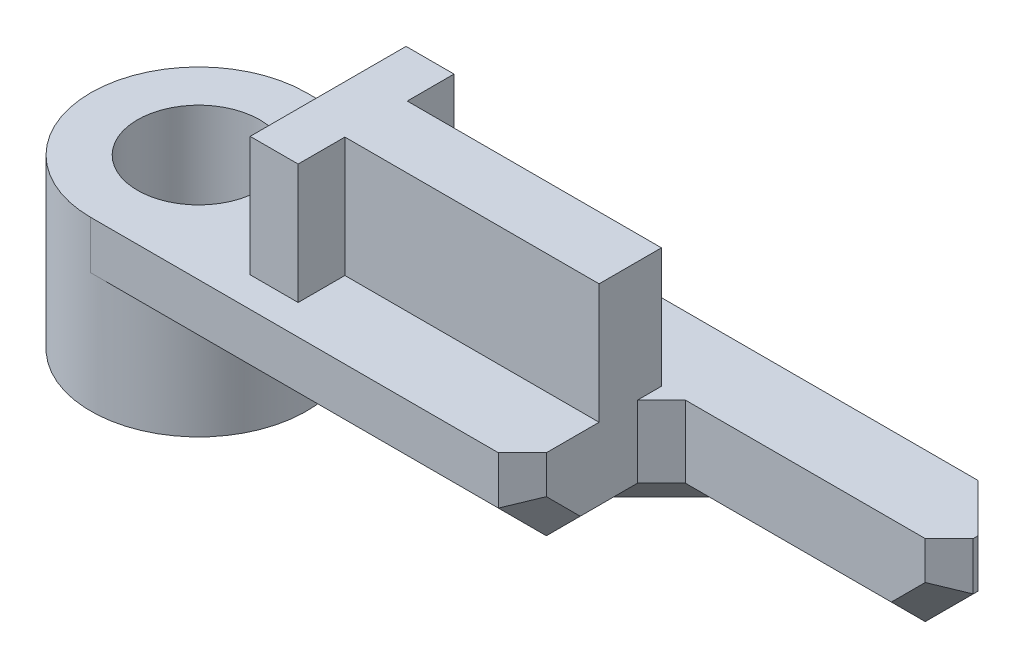
ISO-10303-21;
HEADER;
FILE_DESCRIPTION(('STEP AP214'),'2;1');
FILE_NAME('part.step','',(''),(''),'','','');
FILE_SCHEMA(('AUTOMOTIVE_DESIGN { 1 0 10303 214 1 1 1 1 }'));
ENDSEC;
DATA;
#1=APPLICATION_CONTEXT('core data for automotive mechanical design processes');
#2=APPLICATION_PROTOCOL_DEFINITION('international standard','automotive_design',2000,#1);
#3=PRODUCT_CONTEXT('',#1,'mechanical');
#4=PRODUCT('Part','Part','',(#3));
#5=PRODUCT_RELATED_PRODUCT_CATEGORY('part','',(#4));
#6=PRODUCT_DEFINITION_FORMATION('','',#4);
#7=PRODUCT_DEFINITION_CONTEXT('part definition',#1,'design');
#8=PRODUCT_DEFINITION('design','',#6,#7);
#9=PRODUCT_DEFINITION_SHAPE('','',#8);
#10=(LENGTH_UNIT() NAMED_UNIT(*) SI_UNIT(.MILLI.,.METRE.));
#11=(NAMED_UNIT(*) PLANE_ANGLE_UNIT() SI_UNIT($,.RADIAN.));
#12=(NAMED_UNIT(*) SI_UNIT($,.STERADIAN.) SOLID_ANGLE_UNIT());
#13=UNCERTAINTY_MEASURE_WITH_UNIT(LENGTH_MEASURE(1.E-05),#10,'distance_accuracy_value','');
#14=(GEOMETRIC_REPRESENTATION_CONTEXT(3) GLOBAL_UNCERTAINTY_ASSIGNED_CONTEXT((#13)) GLOBAL_UNIT_ASSIGNED_CONTEXT((#10,
#11,#12)) REPRESENTATION_CONTEXT('',''));
#15=CARTESIAN_POINT('',(0.,0.,0.));
#16=DIRECTION('',(0.,0.,1.));
#17=DIRECTION('',(1.,0.,0.));
#18=AXIS2_PLACEMENT_3D('',#15,#16,#17);
#19=CARTESIAN_POINT('',(0.,3.,0.));
#20=DIRECTION('',(0.,1.,0.));
#21=DIRECTION('',(0.,0.,-1.));
#22=AXIS2_PLACEMENT_3D('',#19,#20,#21);
#23=PLANE('',#22);
#24=DIRECTION('',(1.,0.,0.));
#25=VECTOR('',#24,1.);
#26=CARTESIAN_POINT('',(0.,3.,2.5));
#27=LINE('',#26,#25);
#28=CARTESIAN_POINT('',(3.74165738677394,3.,2.5));
#29=VERTEX_POINT('',#28);
#30=CARTESIAN_POINT('',(17.,3.,2.5));
#31=VERTEX_POINT('',#30);
#32=EDGE_CURVE('E310',#29,#31,#27,.T.);
#33=ORIENTED_EDGE('',*,*,#32,.F.);
#34=CARTESIAN_POINT('',(0.,3.,0.));
#35=DIRECTION('',(0.,-1.,0.));
#36=DIRECTION('',(0.,0.,-1.));
#37=AXIS2_PLACEMENT_3D('',#34,#35,#36);
#38=CIRCLE('',#37,4.5);
#39=CARTESIAN_POINT('',(3.74165738677394,3.,-2.5));
#40=VERTEX_POINT('',#39);
#41=EDGE_CURVE('E300',#40,#29,#38,.T.);
#42=ORIENTED_EDGE('',*,*,#41,.F.);
#43=DIRECTION('',(-1.,0.,0.));
#44=VECTOR('',#43,1.);
#45=CARTESIAN_POINT('',(0.,3.,-2.5));
#46=LINE('',#45,#44);
#47=CARTESIAN_POINT('',(28.,3.,-2.5));
#48=VERTEX_POINT('',#47);
#49=EDGE_CURVE('E316',#48,#40,#46,.T.);
#50=ORIENTED_EDGE('',*,*,#49,.F.);
#51=DIRECTION('',(0.,0.,-1.));
#52=VECTOR('',#51,1.);
#53=CARTESIAN_POINT('',(28.,3.,0.));
#54=LINE('',#53,#52);
#55=CARTESIAN_POINT('',(28.,3.,-2.29999999999999));
#56=VERTEX_POINT('',#55);
#57=EDGE_CURVE('E313',#56,#48,#54,.T.);
#58=ORIENTED_EDGE('',*,*,#57,.F.);
#59=DIRECTION('',(1.,0.,0.));
#60=VECTOR('',#59,1.);
#61=CARTESIAN_POINT('',(28.,3.,-2.29999999999999));
#62=LINE('',#61,#60);
#63=CARTESIAN_POINT('',(19.,3.,-2.29999999999999));
#64=VERTEX_POINT('',#63);
#65=EDGE_CURVE('E368',#64,#56,#62,.T.);
#66=ORIENTED_EDGE('',*,*,#65,.F.);
#67=DIRECTION('',(-0.707106781186552,0.,0.707106781186543));
#68=VECTOR('',#67,1.);
#69=CARTESIAN_POINT('',(17.,3.,-0.300000000000007));
#70=LINE('',#69,#68);
#71=CARTESIAN_POINT('',(18.,3.,-1.3));
#72=VERTEX_POINT('',#71);
#73=EDGE_CURVE('E371',#64,#72,#70,.T.);
#74=ORIENTED_EDGE('',*,*,#73,.T.);
#75=DIRECTION('',(-0.707106781186552,0.,0.707106781186543));
#76=VECTOR('',#75,1.);
#77=CARTESIAN_POINT('',(17.,3.,-0.300000000000007));
#78=LINE('',#77,#76);
#79=CARTESIAN_POINT('',(17.,3.,-0.300000000000006));
#80=VERTEX_POINT('',#79);
#81=EDGE_CURVE('E374',#72,#80,#78,.T.);
#82=ORIENTED_EDGE('',*,*,#81,.T.);
#83=DIRECTION('',(0.,0.,-1.));
#84=VECTOR('',#83,1.);
#85=CARTESIAN_POINT('',(17.,3.,-1.3));
#86=LINE('',#85,#84);
#87=EDGE_CURVE('E377',#31,#80,#86,.T.);
#88=ORIENTED_EDGE('',*,*,#87,.F.);
#89=EDGE_LOOP('',(#33,#42,#50,#58,#66,#74,#82,#88));
#90=FACE_BOUND('',#89,.T.);
#91=ADVANCED_FACE('F41',(#90),#23,.F.);
#92=CARTESIAN_POINT('',(0.,6.99999999999999,0.));
#93=DIRECTION('',(0.,1.,0.));
#94=DIRECTION('',(0.,0.,-1.));
#95=AXIS2_PLACEMENT_3D('',#92,#93,#94);
#96=PLANE('',#95);
#97=CARTESIAN_POINT('',(0.,6.99999999999999,0.));
#98=DIRECTION('',(0.,-1.,0.));
#99=DIRECTION('',(0.,0.,-1.));
#100=AXIS2_PLACEMENT_3D('',#97,#98,#99);
#101=CIRCLE('',#100,2.55);
#102=CARTESIAN_POINT('',(0.,6.99999999999999,-2.55));
#103=VERTEX_POINT('',#102);
#104=EDGE_CURVE('E274',#103,#103,#101,.T.);
#105=ORIENTED_EDGE('',*,*,#104,.T.);
#106=EDGE_LOOP('',(#105));
#107=FACE_BOUND('',#106,.T.);
#108=DIRECTION('',(0.,0.,1.));
#109=VECTOR('',#108,1.);
#110=CARTESIAN_POINT('',(18.,6.99999999999999,0.));
#111=LINE('',#110,#109);
#112=CARTESIAN_POINT('',(18.,6.99999999999999,1.3));
#113=VERTEX_POINT('',#112);
#114=CARTESIAN_POINT('',(18.,6.99999999999999,3.5));
#115=VERTEX_POINT('',#114);
#116=EDGE_CURVE('E270',#113,#115,#111,.T.);
#117=ORIENTED_EDGE('',*,*,#116,.F.);
#118=DIRECTION('',(1.,0.,0.));
#119=VECTOR('',#118,1.);
#120=CARTESIAN_POINT('',(0.,6.99999999999999,1.3));
#121=LINE('',#120,#119);
#122=CARTESIAN_POINT('',(7.4,6.99999999999999,1.3));
#123=VERTEX_POINT('',#122);
#124=EDGE_CURVE('E243',#123,#113,#121,.T.);
#125=ORIENTED_EDGE('',*,*,#124,.F.);
#126=DIRECTION('',(0.,0.,1.));
#127=VECTOR('',#126,1.);
#128=CARTESIAN_POINT('',(7.4,6.99999999999999,0.));
#129=LINE('',#128,#127);
#130=CARTESIAN_POINT('',(7.4,6.99999999999999,3.25));
#131=VERTEX_POINT('',#130);
#132=EDGE_CURVE('E214',#123,#131,#129,.T.);
#133=ORIENTED_EDGE('',*,*,#132,.T.);
#134=DIRECTION('',(1.,0.,0.));
#135=VECTOR('',#134,1.);
#136=CARTESIAN_POINT('',(0.,6.99999999999999,3.25));
#137=LINE('',#136,#135);
#138=CARTESIAN_POINT('',(5.4,6.99999999999999,3.25));
#139=VERTEX_POINT('',#138);
#140=EDGE_CURVE('E246',#139,#131,#137,.T.);
#141=ORIENTED_EDGE('',*,*,#140,.F.);
#142=DIRECTION('',(0.,0.,1.));
#143=VECTOR('',#142,1.);
#144=CARTESIAN_POINT('',(5.4,6.99999999999999,0.));
#145=LINE('',#144,#143);
#146=CARTESIAN_POINT('',(5.4,6.99999999999999,-3.25));
#147=VERTEX_POINT('',#146);
#148=EDGE_CURVE('E249',#147,#139,#145,.T.);
#149=ORIENTED_EDGE('',*,*,#148,.F.);
#150=DIRECTION('',(1.,0.,0.));
#151=VECTOR('',#150,1.);
#152=CARTESIAN_POINT('',(0.,6.99999999999999,-3.25));
#153=LINE('',#152,#151);
#154=CARTESIAN_POINT('',(7.4,6.99999999999999,-3.25));
#155=VERTEX_POINT('',#154);
#156=EDGE_CURVE('E252',#147,#155,#153,.T.);
#157=ORIENTED_EDGE('',*,*,#156,.T.);
#158=DIRECTION('',(0.,0.,1.));
#159=VECTOR('',#158,1.);
#160=CARTESIAN_POINT('',(7.4,6.99999999999999,0.));
#161=LINE('',#160,#159);
#162=CARTESIAN_POINT('',(7.4,6.99999999999999,-1.3));
#163=VERTEX_POINT('',#162);
#164=EDGE_CURVE('E227',#155,#163,#161,.T.);
#165=ORIENTED_EDGE('',*,*,#164,.T.);
#166=DIRECTION('',(1.,0.,0.));
#167=VECTOR('',#166,1.);
#168=CARTESIAN_POINT('',(0.,6.99999999999999,-1.3));
#169=LINE('',#168,#167);
#170=CARTESIAN_POINT('',(18.,6.99999999999999,-1.3));
#171=VERTEX_POINT('',#170);
#172=EDGE_CURVE('E224',#163,#171,#169,.T.);
#173=ORIENTED_EDGE('',*,*,#172,.T.);
#174=DIRECTION('',(0.,0.,1.));
#175=VECTOR('',#174,1.);
#176=CARTESIAN_POINT('',(18.,6.99999999999999,0.));
#177=LINE('',#176,#175);
#178=CARTESIAN_POINT('',(18.,6.99999999999999,-0.300000000000006));
#179=VERTEX_POINT('',#178);
#180=EDGE_CURVE('E345',#171,#179,#177,.T.);
#181=ORIENTED_EDGE('',*,*,#180,.T.);
#182=DIRECTION('',(0.707106781186552,0.,-0.707106781186543));
#183=VECTOR('',#182,1.);
#184=CARTESIAN_POINT('',(19.,6.99999999999999,-1.3));
#185=LINE('',#184,#183);
#186=CARTESIAN_POINT('',(19.,6.99999999999999,-1.3));
#187=VERTEX_POINT('',#186);
#188=EDGE_CURVE('E11',#187,#179,#185,.F.);
#189=ORIENTED_EDGE('',*,*,#188,.F.);
#190=DIRECTION('',(-1.,0.,0.));
#191=VECTOR('',#190,1.);
#192=CARTESIAN_POINT('',(0.,6.99999999999999,-1.3));
#193=LINE('',#192,#191);
#194=CARTESIAN_POINT('',(29.,6.99999999999999,-1.3));
#195=VERTEX_POINT('',#194);
#196=EDGE_CURVE('E218',#195,#187,#193,.T.);
#197=ORIENTED_EDGE('',*,*,#196,.F.);
#198=DIRECTION('',(-0.707106781186552,0.,0.707106781186543));
#199=VECTOR('',#198,1.);
#200=CARTESIAN_POINT('',(13.8499999999998,6.99999999999999,13.85));
#201=LINE('',#200,#199);
#202=CARTESIAN_POINT('',(30.,6.99999999999999,-2.29999999999999));
#203=VERTEX_POINT('',#202);
#204=EDGE_CURVE('E356',#203,#195,#201,.T.);
#205=ORIENTED_EDGE('',*,*,#204,.F.);
#206=DIRECTION('',(0.,0.,1.));
#207=VECTOR('',#206,1.);
#208=CARTESIAN_POINT('',(30.,6.99999999999999,-4.5));
#209=LINE('',#208,#207);
#210=CARTESIAN_POINT('',(30.,6.99999999999999,-2.5));
#211=VERTEX_POINT('',#210);
#212=EDGE_CURVE('E284',#211,#203,#209,.T.);
#213=ORIENTED_EDGE('',*,*,#212,.F.);
#214=DIRECTION('',(-0.707106781186549,0.,-0.707106781186546));
#215=VECTOR('',#214,1.);
#216=CARTESIAN_POINT('',(16.2499999999999,6.99999999999999,-16.25));
#217=LINE('',#216,#215);
#218=CARTESIAN_POINT('',(28.,6.99999999999999,-4.5));
#219=VERTEX_POINT('',#218);
#220=EDGE_CURVE('E325',#219,#211,#217,.F.);
#221=ORIENTED_EDGE('',*,*,#220,.F.);
#222=DIRECTION('',(1.,0.,0.));
#223=VECTOR('',#222,1.);
#224=CARTESIAN_POINT('',(0.,6.99999999999999,-4.5));
#225=LINE('',#224,#223);
#226=CARTESIAN_POINT('',(0.,6.99999999999999,-4.5));
#227=VERTEX_POINT('',#226);
#228=EDGE_CURVE('E281',#227,#219,#225,.T.);
#229=ORIENTED_EDGE('',*,*,#228,.F.);
#230=CARTESIAN_POINT('',(0.,6.99999999999999,0.));
#231=DIRECTION('',(0.,-1.,0.));
#232=DIRECTION('',(0.,0.,-1.));
#233=AXIS2_PLACEMENT_3D('',#230,#231,#232);
#234=CIRCLE('',#233,4.5);
#235=CARTESIAN_POINT('',(0.,6.99999999999999,4.5));
#236=VERTEX_POINT('',#235);
#237=EDGE_CURVE('E277',#236,#227,#234,.T.);
#238=ORIENTED_EDGE('',*,*,#237,.F.);
#239=DIRECTION('',(-1.,0.,0.));
#240=VECTOR('',#239,1.);
#241=CARTESIAN_POINT('',(0.,6.99999999999999,4.5));
#242=LINE('',#241,#240);
#243=CARTESIAN_POINT('',(17.,6.99999999999999,4.5));
#244=VERTEX_POINT('',#243);
#245=EDGE_CURVE('E287',#244,#236,#242,.T.);
#246=ORIENTED_EDGE('',*,*,#245,.F.);
#247=DIRECTION('',(-0.707106781186547,0.,0.707106781186549));
#248=VECTOR('',#247,1.);
#249=CARTESIAN_POINT('',(10.75,6.99999999999999,10.75));
#250=LINE('',#249,#248);
#251=EDGE_CURVE('E359',#115,#244,#250,.T.);
#252=ORIENTED_EDGE('',*,*,#251,.F.);
#253=EDGE_LOOP('',(#117,#125,#133,#141,#149,#157,#165,#173,#181,#189,#197,#205,#213,#221,#229,
#238,#246,#252));
#254=FACE_BOUND('',#253,.T.);
#255=ADVANCED_FACE('F425',(#107,#254),#96,.T.);
#256=CARTESIAN_POINT('',(30.,6.99999999999999,-4.5));
#257=DIRECTION('',(-1.,0.,0.));
#258=DIRECTION('',(0.,0.,-1.));
#259=AXIS2_PLACEMENT_3D('',#256,#257,#258);
#260=PLANE('',#259);
#261=DIRECTION('',(0.,0.,1.));
#262=VECTOR('',#261,1.);
#263=CARTESIAN_POINT('',(30.,5.,-4.5));
#264=LINE('',#263,#262);
#265=CARTESIAN_POINT('',(30.,5.,-2.5));
#266=VERTEX_POINT('',#265);
#267=CARTESIAN_POINT('',(30.,5.,-2.29999999999999));
#268=VERTEX_POINT('',#267);
#269=EDGE_CURVE('E319',#266,#268,#264,.T.);
#270=ORIENTED_EDGE('',*,*,#269,.F.);
#271=DIRECTION('',(0.,-1.,0.));
#272=VECTOR('',#271,1.);
#273=CARTESIAN_POINT('',(30.,6.99999999999999,-2.5));
#274=LINE('',#273,#272);
#275=EDGE_CURVE('E322',#211,#266,#274,.T.);
#276=ORIENTED_EDGE('',*,*,#275,.F.);
#277=ORIENTED_EDGE('',*,*,#212,.T.);
#278=DIRECTION('',(0.,1.,0.));
#279=VECTOR('',#278,1.);
#280=CARTESIAN_POINT('',(30.,6.99999999999999,-2.29999999999999));
#281=LINE('',#280,#279);
#282=EDGE_CURVE('E380',#268,#203,#281,.T.);
#283=ORIENTED_EDGE('',*,*,#282,.F.);
#284=EDGE_LOOP('',(#270,#276,#277,#283));
#285=FACE_BOUND('',#284,.T.);
#286=ADVANCED_FACE('F410',(#285),#260,.F.);
#287=CARTESIAN_POINT('',(0.,6.99999999999999,4.5));
#288=DIRECTION('',(0.,0.,-1.));
#289=DIRECTION('',(1.,0.,0.));
#290=AXIS2_PLACEMENT_3D('',#287,#288,#289);
#291=PLANE('',#290);
#292=ORIENTED_EDGE('',*,*,#245,.T.);
#293=DIRECTION('',(0.,-1.,0.));
#294=VECTOR('',#293,1.);
#295=CARTESIAN_POINT('',(0.,6.99999999999999,4.5));
#296=LINE('',#295,#294);
#297=CARTESIAN_POINT('',(0.,5.00000000000001,4.5));
#298=VERTEX_POINT('',#297);
#299=EDGE_CURVE('E290',#236,#298,#296,.T.);
#300=ORIENTED_EDGE('',*,*,#299,.T.);
#301=DIRECTION('',(-1.,0.,0.));
#302=VECTOR('',#301,1.);
#303=CARTESIAN_POINT('',(0.,5.00000000000001,4.5));
#304=LINE('',#303,#302);
#305=CARTESIAN_POINT('',(17.,5.00000000000001,4.5));
#306=VERTEX_POINT('',#305);
#307=EDGE_CURVE('E328',#306,#298,#304,.T.);
#308=ORIENTED_EDGE('',*,*,#307,.F.);
#309=DIRECTION('',(0.,-1.,0.));
#310=VECTOR('',#309,1.);
#311=CARTESIAN_POINT('',(17.,5.00000000000001,4.5));
#312=LINE('',#311,#310);
#313=EDGE_CURVE('E362',#244,#306,#312,.T.);
#314=ORIENTED_EDGE('',*,*,#313,.F.);
#315=EDGE_LOOP('',(#292,#300,#308,#314));
#316=FACE_BOUND('',#315,.T.);
#317=ADVANCED_FACE('F463',(#316),#291,.F.);
#318=CARTESIAN_POINT('',(0.,5.00000000000001,4.5));
#319=DIRECTION('',(0.,0.707106781186546,-0.707106781186549));
#320=DIRECTION('',(-1.,0.,0.));
#321=AXIS2_PLACEMENT_3D('',#318,#319,#320);
#322=PLANE('',#321);
#323=ORIENTED_EDGE('',*,*,#307,.T.);
#324=CARTESIAN_POINT('',(0.,0.49999999999999,0.));
#325=DIRECTION('',(0.,-0.707106781186546,0.707106781186549));
#326=DIRECTION('',(0.,-0.707106781186549,-0.707106781186546));
#327=AXIS2_PLACEMENT_3D('',#324,#325,#326);
#328=ELLIPSE('',#327,6.36396103067894,4.5);
#329=EDGE_CURVE('E334',#298,#29,#328,.F.);
#330=ORIENTED_EDGE('',*,*,#329,.T.);
#331=ORIENTED_EDGE('',*,*,#32,.T.);
#332=DIRECTION('',(0.,0.707106781186549,0.707106781186546));
#333=VECTOR('',#332,1.);
#334=CARTESIAN_POINT('',(17.,5.00000000000001,4.5));
#335=LINE('',#334,#333);
#336=EDGE_CURVE('E365',#306,#31,#335,.F.);
#337=ORIENTED_EDGE('',*,*,#336,.F.);
#338=EDGE_LOOP('',(#323,#330,#331,#337));
#339=FACE_BOUND('',#338,.T.);
#340=ADVANCED_FACE('F466',(#339),#322,.F.);
#341=CARTESIAN_POINT('',(30.,5.,-4.5));
#342=DIRECTION('',(-0.707106781186546,0.707106781186549,0.));
#343=DIRECTION('',(0.,0.,1.));
#344=AXIS2_PLACEMENT_3D('',#341,#342,#343);
#345=PLANE('',#344);
#346=ORIENTED_EDGE('',*,*,#57,.T.);
#347=DIRECTION('',(-0.707106781186549,-0.707106781186546,0.));
#348=VECTOR('',#347,1.);
#349=CARTESIAN_POINT('',(29.,4.,-2.5));
#350=LINE('',#349,#348);
#351=EDGE_CURVE('E338',#48,#266,#350,.F.);
#352=ORIENTED_EDGE('',*,*,#351,.T.);
#353=ORIENTED_EDGE('',*,*,#269,.T.);
#354=DIRECTION('',(-0.707106781186549,-0.707106781186546,0.));
#355=VECTOR('',#354,1.);
#356=CARTESIAN_POINT('',(30.,5.,-2.29999999999999));
#357=LINE('',#356,#355);
#358=EDGE_CURVE('E50',#56,#268,#357,.F.);
#359=ORIENTED_EDGE('',*,*,#358,.F.);
#360=EDGE_LOOP('',(#346,#352,#353,#359));
#361=FACE_BOUND('',#360,.T.);
#362=ADVANCED_FACE('F413',(#361),#345,.F.);
#363=CARTESIAN_POINT('',(0.,0.,0.));
#364=DIRECTION('',(0.,1.,0.));
#365=DIRECTION('',(0.,0.,-1.));
#366=AXIS2_PLACEMENT_3D('',#363,#364,#365);
#367=PLANE('',#366);
#368=CARTESIAN_POINT('',(0.,0.,0.));
#369=DIRECTION('',(0.,-1.,0.));
#370=DIRECTION('',(0.,0.,-1.));
#371=AXIS2_PLACEMENT_3D('',#368,#369,#370);
#372=CIRCLE('',#371,4.5);
#373=CARTESIAN_POINT('',(0.,0.,-4.5));
#374=VERTEX_POINT('',#373);
#375=EDGE_CURVE('E299',#374,#374,#372,.T.);
#376=ORIENTED_EDGE('',*,*,#375,.T.);
#377=EDGE_LOOP('',(#376));
#378=FACE_BOUND('',#377,.T.);
#379=CARTESIAN_POINT('',(0.,0.,0.));
#380=DIRECTION('',(0.,-1.,0.));
#381=DIRECTION('',(0.,0.,-1.));
#382=AXIS2_PLACEMENT_3D('',#379,#380,#381);
#383=CIRCLE('',#382,2.55);
#384=CARTESIAN_POINT('',(0.,0.,-2.55));
#385=VERTEX_POINT('',#384);
#386=EDGE_CURVE('E296',#385,#385,#383,.T.);
#387=ORIENTED_EDGE('',*,*,#386,.F.);
#388=EDGE_LOOP('',(#387));
#389=FACE_BOUND('',#388,.T.);
#390=ADVANCED_FACE('F478',(#378,#389),#367,.F.);
#391=CARTESIAN_POINT('',(0.,3.,0.));
#392=DIRECTION('',(0.,-1.,0.));
#393=DIRECTION('',(0.,0.,1.));
#394=AXIS2_PLACEMENT_3D('',#391,#392,#393);
#395=CYLINDRICAL_SURFACE('',#394,4.5);
#396=ORIENTED_EDGE('',*,*,#41,.T.);
#397=ORIENTED_EDGE('',*,*,#329,.F.);
#398=ORIENTED_EDGE('',*,*,#299,.F.);
#399=ORIENTED_EDGE('',*,*,#237,.T.);
#400=DIRECTION('',(0.,-1.,0.));
#401=VECTOR('',#400,1.);
#402=CARTESIAN_POINT('',(0.,6.99999999999999,-4.5));
#403=LINE('',#402,#401);
#404=CARTESIAN_POINT('',(0.,5.00000000000001,-4.5));
#405=VERTEX_POINT('',#404);
#406=EDGE_CURVE('E293',#227,#405,#403,.T.);
#407=ORIENTED_EDGE('',*,*,#406,.T.);
#408=CARTESIAN_POINT('',(0.,0.49999999999999,0.));
#409=DIRECTION('',(0.,-0.707106781186546,-0.707106781186549));
#410=DIRECTION('',(0.,-0.707106781186549,0.707106781186546));
#411=AXIS2_PLACEMENT_3D('',#408,#409,#410);
#412=ELLIPSE('',#411,6.36396103067894,4.5);
#413=EDGE_CURVE('E331',#40,#405,#412,.F.);
#414=ORIENTED_EDGE('',*,*,#413,.F.);
#415=EDGE_LOOP('',(#396,#397,#398,#399,#407,#414));
#416=FACE_BOUND('',#415,.T.);
#417=ORIENTED_EDGE('',*,*,#375,.F.);
#418=EDGE_LOOP('',(#417));
#419=FACE_BOUND('',#418,.T.);
#420=ADVANCED_FACE('F476',(#416,#419),#395,.T.);
#421=CARTESIAN_POINT('',(0.,3.,0.));
#422=DIRECTION('',(0.,-1.,0.));
#423=DIRECTION('',(0.,0.,1.));
#424=AXIS2_PLACEMENT_3D('',#421,#422,#423);
#425=CYLINDRICAL_SURFACE('',#424,2.55);
#426=ORIENTED_EDGE('',*,*,#386,.T.);
#427=EDGE_LOOP('',(#426));
#428=FACE_BOUND('',#427,.T.);
#429=ORIENTED_EDGE('',*,*,#104,.F.);
#430=EDGE_LOOP('',(#429));
#431=FACE_BOUND('',#430,.T.);
#432=ADVANCED_FACE('F472',(#428,#431),#425,.F.);
#433=CARTESIAN_POINT('',(0.,6.99999999999999,-4.5));
#434=DIRECTION('',(0.,0.,1.));
#435=DIRECTION('',(-1.,0.,0.));
#436=AXIS2_PLACEMENT_3D('',#433,#434,#435);
#437=PLANE('',#436);
#438=ORIENTED_EDGE('',*,*,#406,.F.);
#439=ORIENTED_EDGE('',*,*,#228,.T.);
#440=DIRECTION('',(0.,1.,0.));
#441=VECTOR('',#440,1.);
#442=CARTESIAN_POINT('',(28.,6.99999999999999,-4.5));
#443=LINE('',#442,#441);
#444=CARTESIAN_POINT('',(28.,5.00000000000001,-4.5));
#445=VERTEX_POINT('',#444);
#446=EDGE_CURVE('E303',#445,#219,#443,.T.);
#447=ORIENTED_EDGE('',*,*,#446,.F.);
#448=DIRECTION('',(1.,0.,0.));
#449=VECTOR('',#448,1.);
#450=CARTESIAN_POINT('',(0.,5.00000000000001,-4.5));
#451=LINE('',#450,#449);
#452=EDGE_CURVE('E307',#405,#445,#451,.T.);
#453=ORIENTED_EDGE('',*,*,#452,.F.);
#454=EDGE_LOOP('',(#438,#439,#447,#453));
#455=FACE_BOUND('',#454,.T.);
#456=ADVANCED_FACE('F451',(#455),#437,.F.);
#457=CARTESIAN_POINT('',(30.,6.99999999999999,-2.5));
#458=DIRECTION('',(-0.707106781186546,0.,0.707106781186549));
#459=DIRECTION('',(0.,-1.,0.));
#460=AXIS2_PLACEMENT_3D('',#457,#458,#459);
#461=PLANE('',#460);
#462=ORIENTED_EDGE('',*,*,#220,.T.);
#463=ORIENTED_EDGE('',*,*,#275,.T.);
#464=DIRECTION('',(0.707106781186549,0.,0.707106781186546));
#465=VECTOR('',#464,1.);
#466=CARTESIAN_POINT('',(28.,5.00000000000001,-4.5));
#467=LINE('',#466,#465);
#468=EDGE_CURVE('E278',#266,#445,#467,.F.);
#469=ORIENTED_EDGE('',*,*,#468,.T.);
#470=ORIENTED_EDGE('',*,*,#446,.T.);
#471=EDGE_LOOP('',(#462,#463,#469,#470));
#472=FACE_BOUND('',#471,.T.);
#473=ADVANCED_FACE('F419',(#472),#461,.F.);
#474=CARTESIAN_POINT('',(28.,5.00000000000001,-4.5));
#475=DIRECTION('',(0.577350269189623,-0.577350269189626,-0.577350269189629));
#476=DIRECTION('',(0.,-0.707106781186549,0.707106781186546));
#477=AXIS2_PLACEMENT_3D('',#474,#475,#476);
#478=PLANE('',#477);
#479=ORIENTED_EDGE('',*,*,#351,.F.);
#480=DIRECTION('',(0.,0.707106781186549,-0.707106781186546));
#481=VECTOR('',#480,1.);
#482=CARTESIAN_POINT('',(28.,5.00000000000001,-4.5));
#483=LINE('',#482,#481);
#484=EDGE_CURVE('E273',#48,#445,#483,.T.);
#485=ORIENTED_EDGE('',*,*,#484,.T.);
#486=ORIENTED_EDGE('',*,*,#468,.F.);
#487=EDGE_LOOP('',(#479,#485,#486));
#488=FACE_BOUND('',#487,.T.);
#489=ADVANCED_FACE('F442',(#488),#478,.T.);
#490=CARTESIAN_POINT('',(0.,5.00000000000001,-4.5));
#491=DIRECTION('',(0.,0.707106781186546,0.707106781186549));
#492=DIRECTION('',(1.,0.,0.));
#493=AXIS2_PLACEMENT_3D('',#490,#491,#492);
#494=PLANE('',#493);
#495=ORIENTED_EDGE('',*,*,#413,.T.);
#496=ORIENTED_EDGE('',*,*,#452,.T.);
#497=ORIENTED_EDGE('',*,*,#484,.F.);
#498=ORIENTED_EDGE('',*,*,#49,.T.);
#499=EDGE_LOOP('',(#495,#496,#497,#498));
#500=FACE_BOUND('',#499,.T.);
#501=ADVANCED_FACE('F441',(#500),#494,.F.);
#502=CARTESIAN_POINT('',(18.,0.,0.));
#503=DIRECTION('',(1.,0.,0.));
#504=DIRECTION('',(0.,0.,1.));
#505=AXIS2_PLACEMENT_3D('',#502,#503,#504);
#506=PLANE('',#505);
#507=DIRECTION('',(0.,0.707106781186549,0.707106781186546));
#508=VECTOR('',#507,1.);
#509=CARTESIAN_POINT('',(18.,0.957106781186542,-0.957106781186547));
#510=LINE('',#509,#508);
#511=CARTESIAN_POINT('',(18.,4.00000000000001,2.0857864376269));
#512=VERTEX_POINT('',#511);
#513=CARTESIAN_POINT('',(18.,5.41421356237311,3.5));
#514=VERTEX_POINT('',#513);
#515=EDGE_CURVE('E351',#512,#514,#510,.T.);
#516=ORIENTED_EDGE('',*,*,#515,.F.);
#517=DIRECTION('',(0.,0.,1.));
#518=VECTOR('',#517,1.);
#519=CARTESIAN_POINT('',(18.,4.00000000000001,2.5));
#520=LINE('',#519,#518);
#521=CARTESIAN_POINT('',(18.,4.00000000000001,-0.300000000000006));
#522=VERTEX_POINT('',#521);
#523=EDGE_CURVE('E348',#522,#512,#520,.T.);
#524=ORIENTED_EDGE('',*,*,#523,.F.);
#525=DIRECTION('',(0.,-1.,0.));
#526=VECTOR('',#525,1.);
#527=CARTESIAN_POINT('',(18.,3.,-0.300000000000006));
#528=LINE('',#527,#526);
#529=EDGE_CURVE('E336',#179,#522,#528,.T.);
#530=ORIENTED_EDGE('',*,*,#529,.F.);
#531=ORIENTED_EDGE('',*,*,#180,.F.);
#532=DIRECTION('',(0.,-1.,0.));
#533=VECTOR('',#532,1.);
#534=CARTESIAN_POINT('',(18.,12.,-1.3));
#535=LINE('',#534,#533);
#536=CARTESIAN_POINT('',(18.,12.,-1.3));
#537=VERTEX_POINT('',#536);
#538=EDGE_CURVE('E58',#537,#171,#535,.T.);
#539=ORIENTED_EDGE('',*,*,#538,.F.);
#540=DIRECTION('',(0.,0.,1.));
#541=VECTOR('',#540,1.);
#542=CARTESIAN_POINT('',(18.,12.,0.));
#543=LINE('',#542,#541);
#544=CARTESIAN_POINT('',(18.,12.,1.3));
#545=VERTEX_POINT('',#544);
#546=EDGE_CURVE('E241',#537,#545,#543,.T.);
#547=ORIENTED_EDGE('',*,*,#546,.T.);
#548=DIRECTION('',(0.,-1.,0.));
#549=VECTOR('',#548,1.);
#550=CARTESIAN_POINT('',(18.,12.,1.3));
#551=LINE('',#550,#549);
#552=EDGE_CURVE('E222',#545,#113,#551,.T.);
#553=ORIENTED_EDGE('',*,*,#552,.T.);
#554=ORIENTED_EDGE('',*,*,#116,.T.);
#555=DIRECTION('',(0.,1.,0.));
#556=VECTOR('',#555,1.);
#557=CARTESIAN_POINT('',(18.,6.99999999999999,3.5));
#558=LINE('',#557,#556);
#559=EDGE_CURVE('E354',#514,#115,#558,.T.);
#560=ORIENTED_EDGE('',*,*,#559,.F.);
#561=EDGE_LOOP('',(#516,#524,#530,#531,#539,#547,#553,#554,#560));
#562=FACE_BOUND('',#561,.T.);
#563=ADVANCED_FACE('F449',(#562),#506,.T.);
#564=CARTESIAN_POINT('',(0.,0.,-1.3));
#565=DIRECTION('',(0.,0.,1.));
#566=DIRECTION('',(-1.,0.,0.));
#567=AXIS2_PLACEMENT_3D('',#564,#565,#566);
#568=PLANE('',#567);
#569=ORIENTED_EDGE('',*,*,#196,.T.);
#570=DIRECTION('',(0.,1.,0.));
#571=VECTOR('',#570,1.);
#572=CARTESIAN_POINT('',(19.,6.99999999999999,-1.3));
#573=LINE('',#572,#571);
#574=CARTESIAN_POINT('',(19.,4.00000000000001,-1.3));
#575=VERTEX_POINT('',#574);
#576=EDGE_CURVE('E382',#575,#187,#573,.T.);
#577=ORIENTED_EDGE('',*,*,#576,.F.);
#578=DIRECTION('',(-1.,0.,0.));
#579=VECTOR('',#578,1.);
#580=CARTESIAN_POINT('',(18.,4.00000000000001,-1.3));
#581=LINE('',#580,#579);
#582=CARTESIAN_POINT('',(27.5857864376269,4.00000000000001,-1.3));
#583=VERTEX_POINT('',#582);
#584=EDGE_CURVE('E384',#583,#575,#581,.T.);
#585=ORIENTED_EDGE('',*,*,#584,.F.);
#586=DIRECTION('',(-0.707106781186549,-0.707106781186546,0.));
#587=VECTOR('',#586,1.);
#588=CARTESIAN_POINT('',(11.7928932188134,-11.7928932188134,-1.3));
#589=LINE('',#588,#587);
#590=CARTESIAN_POINT('',(29.,5.4142135623731,-1.3));
#591=VERTEX_POINT('',#590);
#592=EDGE_CURVE('E387',#591,#583,#589,.T.);
#593=ORIENTED_EDGE('',*,*,#592,.F.);
#594=DIRECTION('',(0.,-1.,0.));
#595=VECTOR('',#594,1.);
#596=CARTESIAN_POINT('',(29.,5.,-1.3));
#597=LINE('',#596,#595);
#598=EDGE_CURVE('E389',#195,#591,#597,.T.);
#599=ORIENTED_EDGE('',*,*,#598,.F.);
#600=EDGE_LOOP('',(#569,#577,#585,#593,#599));
#601=FACE_BOUND('',#600,.T.);
#602=ADVANCED_FACE('F430',(#601),#568,.T.);
#603=CARTESIAN_POINT('',(0.,12.,1.3));
#604=DIRECTION('',(0.,0.,1.));
#605=DIRECTION('',(-1.,0.,0.));
#606=AXIS2_PLACEMENT_3D('',#603,#604,#605);
#607=PLANE('',#606);
#608=ORIENTED_EDGE('',*,*,#124,.T.);
#609=ORIENTED_EDGE('',*,*,#552,.F.);
#610=DIRECTION('',(1.,0.,0.));
#611=VECTOR('',#610,1.);
#612=CARTESIAN_POINT('',(0.,12.,1.3));
#613=LINE('',#612,#611);
#614=CARTESIAN_POINT('',(7.4,12.,1.3));
#615=VERTEX_POINT('',#614);
#616=EDGE_CURVE('E203',#615,#545,#613,.T.);
#617=ORIENTED_EDGE('',*,*,#616,.F.);
#618=DIRECTION('',(0.,-1.,0.));
#619=VECTOR('',#618,1.);
#620=CARTESIAN_POINT('',(7.4,12.,1.3));
#621=LINE('',#620,#619);
#622=EDGE_CURVE('E211',#615,#123,#621,.T.);
#623=ORIENTED_EDGE('',*,*,#622,.T.);
#624=EDGE_LOOP('',(#608,#609,#617,#623));
#625=FACE_BOUND('',#624,.T.);
#626=ADVANCED_FACE('F221',(#625),#607,.T.);
#627=CARTESIAN_POINT('',(7.4,12.,0.));
#628=DIRECTION('',(-1.,0.,0.));
#629=DIRECTION('',(0.,0.,-1.));
#630=AXIS2_PLACEMENT_3D('',#627,#628,#629);
#631=PLANE('',#630);
#632=ORIENTED_EDGE('',*,*,#132,.F.);
#633=ORIENTED_EDGE('',*,*,#622,.F.);
#634=DIRECTION('',(0.,0.,1.));
#635=VECTOR('',#634,1.);
#636=CARTESIAN_POINT('',(7.4,12.,0.));
#637=LINE('',#636,#635);
#638=CARTESIAN_POINT('',(7.4,12.,3.25));
#639=VERTEX_POINT('',#638);
#640=EDGE_CURVE('E198',#615,#639,#637,.T.);
#641=ORIENTED_EDGE('',*,*,#640,.T.);
#642=DIRECTION('',(0.,-1.,0.));
#643=VECTOR('',#642,1.);
#644=CARTESIAN_POINT('',(7.4,12.,3.25));
#645=LINE('',#644,#643);
#646=EDGE_CURVE('E219',#639,#131,#645,.T.);
#647=ORIENTED_EDGE('',*,*,#646,.T.);
#648=EDGE_LOOP('',(#632,#633,#641,#647));
#649=FACE_BOUND('',#648,.T.);
#650=ADVANCED_FACE('F212',(#649),#631,.F.);
#651=CARTESIAN_POINT('',(0.,12.,3.25));
#652=DIRECTION('',(0.,0.,1.));
#653=DIRECTION('',(-1.,0.,0.));
#654=AXIS2_PLACEMENT_3D('',#651,#652,#653);
#655=PLANE('',#654);
#656=ORIENTED_EDGE('',*,*,#140,.T.);
#657=ORIENTED_EDGE('',*,*,#646,.F.);
#658=DIRECTION('',(1.,0.,0.));
#659=VECTOR('',#658,1.);
#660=CARTESIAN_POINT('',(0.,12.,3.25));
#661=LINE('',#660,#659);
#662=CARTESIAN_POINT('',(5.4,12.,3.25));
#663=VERTEX_POINT('',#662);
#664=EDGE_CURVE('E206',#663,#639,#661,.T.);
#665=ORIENTED_EDGE('',*,*,#664,.F.);
#666=DIRECTION('',(0.,-1.,0.));
#667=VECTOR('',#666,1.);
#668=CARTESIAN_POINT('',(5.4,12.,3.25));
#669=LINE('',#668,#667);
#670=EDGE_CURVE('E265',#663,#139,#669,.T.);
#671=ORIENTED_EDGE('',*,*,#670,.T.);
#672=EDGE_LOOP('',(#656,#657,#665,#671));
#673=FACE_BOUND('',#672,.T.);
#674=ADVANCED_FACE('F506',(#673),#655,.T.);
#675=CARTESIAN_POINT('',(5.4,12.,0.));
#676=DIRECTION('',(-1.,0.,0.));
#677=DIRECTION('',(0.,0.,-1.));
#678=AXIS2_PLACEMENT_3D('',#675,#676,#677);
#679=PLANE('',#678);
#680=ORIENTED_EDGE('',*,*,#148,.T.);
#681=ORIENTED_EDGE('',*,*,#670,.F.);
#682=DIRECTION('',(0.,0.,1.));
#683=VECTOR('',#682,1.);
#684=CARTESIAN_POINT('',(5.4,12.,0.));
#685=LINE('',#684,#683);
#686=CARTESIAN_POINT('',(5.4,12.,-3.25));
#687=VERTEX_POINT('',#686);
#688=EDGE_CURVE('E231',#687,#663,#685,.T.);
#689=ORIENTED_EDGE('',*,*,#688,.F.);
#690=DIRECTION('',(0.,-1.,0.));
#691=VECTOR('',#690,1.);
#692=CARTESIAN_POINT('',(5.4,12.,-3.25));
#693=LINE('',#692,#691);
#694=EDGE_CURVE('E263',#687,#147,#693,.T.);
#695=ORIENTED_EDGE('',*,*,#694,.T.);
#696=EDGE_LOOP('',(#680,#681,#689,#695));
#697=FACE_BOUND('',#696,.T.);
#698=ADVANCED_FACE('F510',(#697),#679,.T.);
#699=CARTESIAN_POINT('',(0.,12.,-3.25));
#700=DIRECTION('',(0.,0.,1.));
#701=DIRECTION('',(-1.,0.,0.));
#702=AXIS2_PLACEMENT_3D('',#699,#700,#701);
#703=PLANE('',#702);
#704=ORIENTED_EDGE('',*,*,#156,.F.);
#705=ORIENTED_EDGE('',*,*,#694,.F.);
#706=DIRECTION('',(1.,0.,0.));
#707=VECTOR('',#706,1.);
#708=CARTESIAN_POINT('',(0.,12.,-3.25));
#709=LINE('',#708,#707);
#710=CARTESIAN_POINT('',(7.4,12.,-3.25));
#711=VERTEX_POINT('',#710);
#712=EDGE_CURVE('E233',#687,#711,#709,.T.);
#713=ORIENTED_EDGE('',*,*,#712,.T.);
#714=DIRECTION('',(0.,-1.,0.));
#715=VECTOR('',#714,1.);
#716=CARTESIAN_POINT('',(7.4,12.,-3.25));
#717=LINE('',#716,#715);
#718=EDGE_CURVE('E261',#711,#155,#717,.T.);
#719=ORIENTED_EDGE('',*,*,#718,.T.);
#720=EDGE_LOOP('',(#704,#705,#713,#719));
#721=FACE_BOUND('',#720,.T.);
#722=ADVANCED_FACE('F514',(#721),#703,.F.);
#723=CARTESIAN_POINT('',(7.4,12.,0.));
#724=DIRECTION('',(-1.,0.,0.));
#725=DIRECTION('',(0.,0.,-1.));
#726=AXIS2_PLACEMENT_3D('',#723,#724,#725);
#727=PLANE('',#726);
#728=ORIENTED_EDGE('',*,*,#164,.F.);
#729=ORIENTED_EDGE('',*,*,#718,.F.);
#730=DIRECTION('',(0.,0.,1.));
#731=VECTOR('',#730,1.);
#732=CARTESIAN_POINT('',(7.4,12.,0.));
#733=LINE('',#732,#731);
#734=CARTESIAN_POINT('',(7.4,12.,-1.3));
#735=VERTEX_POINT('',#734);
#736=EDGE_CURVE('E236',#711,#735,#733,.T.);
#737=ORIENTED_EDGE('',*,*,#736,.T.);
#738=DIRECTION('',(0.,-1.,0.));
#739=VECTOR('',#738,1.);
#740=CARTESIAN_POINT('',(7.4,12.,-1.3));
#741=LINE('',#740,#739);
#742=EDGE_CURVE('E259',#735,#163,#741,.T.);
#743=ORIENTED_EDGE('',*,*,#742,.T.);
#744=EDGE_LOOP('',(#728,#729,#737,#743));
#745=FACE_BOUND('',#744,.T.);
#746=ADVANCED_FACE('F518',(#745),#727,.F.);
#747=CARTESIAN_POINT('',(0.,12.,-1.3));
#748=DIRECTION('',(0.,0.,1.));
#749=DIRECTION('',(-1.,0.,0.));
#750=AXIS2_PLACEMENT_3D('',#747,#748,#749);
#751=PLANE('',#750);
#752=ORIENTED_EDGE('',*,*,#172,.F.);
#753=ORIENTED_EDGE('',*,*,#742,.F.);
#754=DIRECTION('',(1.,0.,0.));
#755=VECTOR('',#754,1.);
#756=CARTESIAN_POINT('',(0.,12.,-1.3));
#757=LINE('',#756,#755);
#758=EDGE_CURVE('E239',#735,#537,#757,.T.);
#759=ORIENTED_EDGE('',*,*,#758,.T.);
#760=ORIENTED_EDGE('',*,*,#538,.T.);
#761=EDGE_LOOP('',(#752,#753,#759,#760));
#762=FACE_BOUND('',#761,.T.);
#763=ADVANCED_FACE('F520',(#762),#751,.F.);
#764=CARTESIAN_POINT('',(0.,12.,0.));
#765=DIRECTION('',(0.,1.,0.));
#766=DIRECTION('',(0.,0.,-1.));
#767=AXIS2_PLACEMENT_3D('',#764,#765,#766);
#768=PLANE('',#767);
#769=ORIENTED_EDGE('',*,*,#616,.T.);
#770=ORIENTED_EDGE('',*,*,#546,.F.);
#771=ORIENTED_EDGE('',*,*,#758,.F.);
#772=ORIENTED_EDGE('',*,*,#736,.F.);
#773=ORIENTED_EDGE('',*,*,#712,.F.);
#774=ORIENTED_EDGE('',*,*,#688,.T.);
#775=ORIENTED_EDGE('',*,*,#664,.T.);
#776=ORIENTED_EDGE('',*,*,#640,.F.);
#777=EDGE_LOOP('',(#769,#770,#771,#772,#773,#774,#775,#776));
#778=FACE_BOUND('',#777,.T.);
#779=ADVANCED_FACE('F200',(#778),#768,.T.);
#780=CARTESIAN_POINT('',(30.,6.99999999999999,-2.29999999999999));
#781=DIRECTION('',(0.707106781186543,0.,0.707106781186552));
#782=DIRECTION('',(0.,-1.,0.));
#783=AXIS2_PLACEMENT_3D('',#780,#781,#782);
#784=PLANE('',#783);
#785=ORIENTED_EDGE('',*,*,#204,.T.);
#786=ORIENTED_EDGE('',*,*,#598,.T.);
#787=DIRECTION('',(0.678598344545851,-0.281084637714823,-0.678598344545842));
#788=VECTOR('',#787,1.);
#789=CARTESIAN_POINT('',(30.,5.,-2.29999999999999));
#790=LINE('',#789,#788);
#791=EDGE_CURVE('E45',#591,#268,#790,.T.);
#792=ORIENTED_EDGE('',*,*,#791,.T.);
#793=ORIENTED_EDGE('',*,*,#282,.T.);
#794=EDGE_LOOP('',(#785,#786,#792,#793));
#795=FACE_BOUND('',#794,.T.);
#796=ADVANCED_FACE('F43',(#795),#784,.T.);
#797=CARTESIAN_POINT('',(30.,5.,-2.29999999999999));
#798=DIRECTION('',(0.499999999999995,-0.499999999999998,0.707106781186552));
#799=DIRECTION('',(-0.707106781186549,-0.707106781186546,0.));
#800=AXIS2_PLACEMENT_3D('',#797,#798,#799);
#801=PLANE('',#800);
#802=ORIENTED_EDGE('',*,*,#791,.F.);
#803=ORIENTED_EDGE('',*,*,#592,.T.);
#804=DIRECTION('',(0.281084637714821,-0.678598344545852,-0.678598344545842));
#805=VECTOR('',#804,1.);
#806=CARTESIAN_POINT('',(25.4062728006793,9.26181138169608,3.961811381696));
#807=LINE('',#806,#805);
#808=EDGE_CURVE('E401',#583,#56,#807,.T.);
#809=ORIENTED_EDGE('',*,*,#808,.T.);
#810=ORIENTED_EDGE('',*,*,#358,.T.);
#811=EDGE_LOOP('',(#802,#803,#809,#810));
#812=FACE_BOUND('',#811,.T.);
#813=ADVANCED_FACE('F406',(#812),#801,.T.);
#814=CARTESIAN_POINT('',(0.,4.00000000000001,-1.3));
#815=DIRECTION('',(0.,-0.707106781186543,0.707106781186553));
#816=DIRECTION('',(1.,0.,0.));
#817=AXIS2_PLACEMENT_3D('',#814,#815,#816);
#818=PLANE('',#817);
#819=ORIENTED_EDGE('',*,*,#808,.F.);
#820=ORIENTED_EDGE('',*,*,#584,.T.);
#821=DIRECTION('',(0.,-0.707106781186552,-0.707106781186543));
#822=VECTOR('',#821,1.);
#823=CARTESIAN_POINT('',(19.,4.00000000000001,-1.3));
#824=LINE('',#823,#822);
#825=EDGE_CURVE('E400',#575,#64,#824,.T.);
#826=ORIENTED_EDGE('',*,*,#825,.T.);
#827=ORIENTED_EDGE('',*,*,#65,.T.);
#828=EDGE_LOOP('',(#819,#820,#826,#827));
#829=FACE_BOUND('',#828,.T.);
#830=ADVANCED_FACE('F433',(#829),#818,.T.);
#831=CARTESIAN_POINT('',(19.,0.,-1.3));
#832=DIRECTION('',(0.707106781186543,0.,0.707106781186552));
#833=DIRECTION('',(0.,-1.,0.));
#834=AXIS2_PLACEMENT_3D('',#831,#832,#833);
#835=PLANE('',#834);
#836=ORIENTED_EDGE('',*,*,#188,.T.);
#837=ORIENTED_EDGE('',*,*,#529,.T.);
#838=DIRECTION('',(-0.707106781186552,0.,0.707106781186543));
#839=VECTOR('',#838,1.);
#840=CARTESIAN_POINT('',(18.,4.00000000000001,-0.300000000000006));
#841=LINE('',#840,#839);
#842=EDGE_CURVE('E398',#522,#575,#841,.F.);
#843=ORIENTED_EDGE('',*,*,#842,.T.);
#844=ORIENTED_EDGE('',*,*,#576,.T.);
#845=EDGE_LOOP('',(#836,#837,#843,#844));
#846=FACE_BOUND('',#845,.T.);
#847=ADVANCED_FACE('F608',(#846),#835,.T.);
#848=CARTESIAN_POINT('',(18.,4.00000000000001,-0.300000000000006));
#849=DIRECTION('',(0.577350269189626,-0.577350269189618,0.577350269189634));
#850=DIRECTION('',(-0.707106781186552,0.,0.707106781186543));
#851=AXIS2_PLACEMENT_3D('',#848,#849,#850);
#852=PLANE('',#851);
#853=ORIENTED_EDGE('',*,*,#73,.F.);
#854=ORIENTED_EDGE('',*,*,#825,.F.);
#855=ORIENTED_EDGE('',*,*,#842,.F.);
#856=DIRECTION('',(0.707106781186543,0.707106781186552,0.));
#857=VECTOR('',#856,1.);
#858=CARTESIAN_POINT('',(17.,3.,-0.300000000000006));
#859=LINE('',#858,#857);
#860=EDGE_CURVE('E396',#522,#80,#859,.F.);
#861=ORIENTED_EDGE('',*,*,#860,.T.);
#862=ORIENTED_EDGE('',*,*,#81,.F.);
#863=EDGE_LOOP('',(#853,#854,#855,#861,#862));
#864=FACE_BOUND('',#863,.T.);
#865=ADVANCED_FACE('F618',(#864),#852,.T.);
#866=CARTESIAN_POINT('',(18.,4.00000000000001,0.));
#867=DIRECTION('',(0.707106781186552,-0.707106781186543,0.));
#868=DIRECTION('',(0.,0.,-1.));
#869=AXIS2_PLACEMENT_3D('',#866,#867,#868);
#870=PLANE('',#869);
#871=ORIENTED_EDGE('',*,*,#860,.F.);
#872=ORIENTED_EDGE('',*,*,#523,.T.);
#873=DIRECTION('',(0.678598344545844,0.678598344545853,-0.281084637714813));
#874=VECTOR('',#873,1.);
#875=CARTESIAN_POINT('',(18.3978503510171,4.39785035101709,1.92099142644074));
#876=LINE('',#875,#874);
#877=EDGE_CURVE('E394',#512,#31,#876,.F.);
#878=ORIENTED_EDGE('',*,*,#877,.T.);
#879=ORIENTED_EDGE('',*,*,#87,.T.);
#880=EDGE_LOOP('',(#871,#872,#878,#879));
#881=FACE_BOUND('',#880,.T.);
#882=ADVANCED_FACE('F629',(#881),#870,.T.);
#883=CARTESIAN_POINT('',(17.,5.00000000000001,4.5));
#884=DIRECTION('',(0.707106781186549,-0.499999999999998,0.500000000000001));
#885=DIRECTION('',(0.,0.707106781186549,0.707106781186546));
#886=AXIS2_PLACEMENT_3D('',#883,#884,#885);
#887=PLANE('',#886);
#888=ORIENTED_EDGE('',*,*,#877,.F.);
#889=ORIENTED_EDGE('',*,*,#515,.T.);
#890=DIRECTION('',(0.678598344545846,0.28108463771482,-0.678598344545848));
#891=VECTOR('',#890,1.);
#892=CARTESIAN_POINT('',(17.,5.00000000000001,4.5));
#893=LINE('',#892,#891);
#894=EDGE_CURVE('E392',#514,#306,#893,.F.);
#895=ORIENTED_EDGE('',*,*,#894,.T.);
#896=ORIENTED_EDGE('',*,*,#336,.T.);
#897=EDGE_LOOP('',(#888,#889,#895,#896));
#898=FACE_BOUND('',#897,.T.);
#899=ADVANCED_FACE('F640',(#898),#887,.T.);
#900=CARTESIAN_POINT('',(18.,0.,3.5));
#901=DIRECTION('',(0.707106781186549,0.,0.707106781186547));
#902=DIRECTION('',(0.,-1.,0.));
#903=AXIS2_PLACEMENT_3D('',#900,#901,#902);
#904=PLANE('',#903);
#905=ORIENTED_EDGE('',*,*,#894,.F.);
#906=ORIENTED_EDGE('',*,*,#559,.T.);
#907=ORIENTED_EDGE('',*,*,#251,.T.);
#908=ORIENTED_EDGE('',*,*,#313,.T.);
#909=EDGE_LOOP('',(#905,#906,#907,#908));
#910=FACE_BOUND('',#909,.T.);
#911=ADVANCED_FACE('F651',(#910),#904,.T.);
#912=CLOSED_SHELL('',(#91,#255,#286,#317,#340,#362,#390,#420,#432,#456,#473,#489,#501,#563,#602,
#626,#650,#674,#698,#722,#746,#763,#779,#796,#813,#830,#847,#865,#882,#899,#911));
#913=MANIFOLD_SOLID_BREP('B2',#912);
#914=ADVANCED_BREP_SHAPE_REPRESENTATION('',(#18,#913),#14);
#915=SHAPE_DEFINITION_REPRESENTATION(#9,#914);
ENDSEC;
END-ISO-10303-21;
